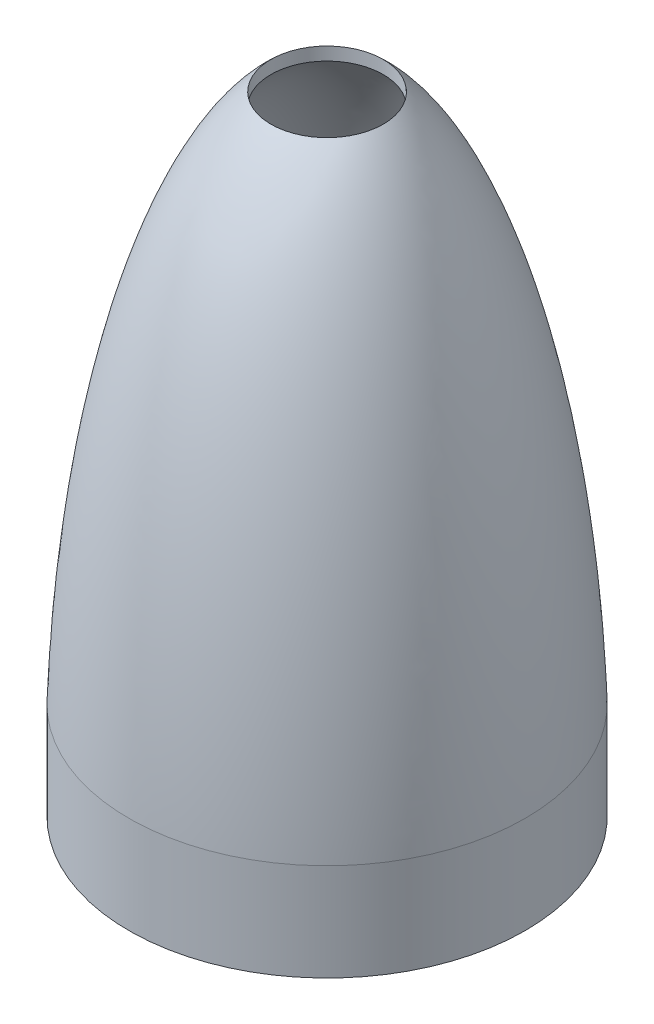
ISO-10303-21;
HEADER;
FILE_DESCRIPTION(('STEP AP214'),'2;1');
FILE_NAME('part.step','',(''),(''),'','','');
FILE_SCHEMA(('AUTOMOTIVE_DESIGN { 1 0 10303 214 1 1 1 1 }'));
ENDSEC;
DATA;
#1=APPLICATION_CONTEXT('core data for automotive mechanical design processes');
#2=APPLICATION_PROTOCOL_DEFINITION('international standard','automotive_design',2000,#1);
#3=PRODUCT_CONTEXT('',#1,'mechanical');
#4=PRODUCT('Part','Part','',(#3));
#5=PRODUCT_RELATED_PRODUCT_CATEGORY('part','',(#4));
#6=PRODUCT_DEFINITION_FORMATION('','',#4);
#7=PRODUCT_DEFINITION_CONTEXT('part definition',#1,'design');
#8=PRODUCT_DEFINITION('design','',#6,#7);
#9=PRODUCT_DEFINITION_SHAPE('','',#8);
#10=(LENGTH_UNIT() NAMED_UNIT(*) SI_UNIT(.MILLI.,.METRE.));
#11=(NAMED_UNIT(*) PLANE_ANGLE_UNIT() SI_UNIT($,.RADIAN.));
#12=(NAMED_UNIT(*) SI_UNIT($,.STERADIAN.) SOLID_ANGLE_UNIT());
#13=UNCERTAINTY_MEASURE_WITH_UNIT(LENGTH_MEASURE(1.E-05),#10,'distance_accuracy_value','');
#14=(GEOMETRIC_REPRESENTATION_CONTEXT(3) GLOBAL_UNCERTAINTY_ASSIGNED_CONTEXT((#13)) GLOBAL_UNIT_ASSIGNED_CONTEXT((#10,
#11,#12)) REPRESENTATION_CONTEXT('',''));
#15=CARTESIAN_POINT('',(0.,0.,0.));
#16=DIRECTION('',(0.,0.,1.));
#17=DIRECTION('',(1.,0.,0.));
#18=AXIS2_PLACEMENT_3D('',#15,#16,#17);
#19=CARTESIAN_POINT('',(0.,0.,0.));
#20=DIRECTION('',(0.,0.,1.));
#21=DIRECTION('',(0.,1.,0.));
#22=AXIS2_PLACEMENT_3D('',#19,#20,#21);
#23=ELLIPSE('',#22,197.916397287442,63.8240305650859);
#24=TRIMMED_CURVE('',#23,(PARAMETER_VALUE(3.14159265358979)),
(PARAMETER_VALUE(6.28318530717959)),.T.,.PARAMETER.);
#25=CARTESIAN_POINT('',(0.,19.918,0.));
#26=DIRECTION('',(0.,-1.,0.));
#27=AXIS1_PLACEMENT('',#25,#26);
#28=SURFACE_OF_REVOLUTION('',#24,#27);
#29=CARTESIAN_POINT('',(0.,189.882362760895,0.));
#30=DIRECTION('',(0.,-1.,0.));
#31=DIRECTION('',(1.,0.,0.));
#32=AXIS2_PLACEMENT_3D('',#29,#30,#31);
#33=CIRCLE('',#32,18.);
#34=CARTESIAN_POINT('',(18.,189.882362760895,0.));
#35=VERTEX_POINT('',#34);
#36=EDGE_CURVE('E65',#35,#35,#33,.T.);
#37=ORIENTED_EDGE('',*,*,#36,.T.);
#38=EDGE_LOOP('',(#37));
#39=FACE_BOUND('',#38,.T.);
#40=CARTESIAN_POINT('',(0.,19.918,0.));
#41=DIRECTION('',(0.,-1.,0.));
#42=DIRECTION('',(1.,0.,0.));
#43=AXIS2_PLACEMENT_3D('',#40,#41,#42);
#44=CIRCLE('',#43,63.5);
#45=CARTESIAN_POINT('',(63.5,19.918,0.));
#46=VERTEX_POINT('',#45);
#47=EDGE_CURVE('E59',#46,#46,#44,.T.);
#48=ORIENTED_EDGE('',*,*,#47,.F.);
#49=EDGE_LOOP('',(#48));
#50=FACE_BOUND('',#49,.T.);
#51=ADVANCED_FACE('F41',(#39,#50),#28,.F.);
#52=CARTESIAN_POINT('',(0.,194.918,0.));
#53=CARTESIAN_POINT('',(0.838027003403198,194.918,0.));
#54=CARTESIAN_POINT('',(2.50348800509016,194.799314319251,0.));
#55=CARTESIAN_POINT('',(5.86823708533804,194.081198554144,0.));
#56=CARTESIAN_POINT('',(10.1460541926094,192.252428145198,0.));
#57=CARTESIAN_POINT('',(15.3902982714895,188.463802804172,0.));
#58=CARTESIAN_POINT('',(22.3996417793312,181.237585071503,0.));
#59=CARTESIAN_POINT('',(30.9343252948244,168.1839351884,0.));
#60=CARTESIAN_POINT('',(40.2045408514973,146.657332097892,0.));
#61=CARTESIAN_POINT('',(48.0987123633596,120.069808877204,0.));
#62=CARTESIAN_POINT('',(53.2754356067489,94.479197256066,0.));
#63=CARTESIAN_POINT('',(56.463723351766,72.4789959620142,0.));
#64=CARTESIAN_POINT('',(58.3579188270842,55.3596395452228,0.));
#65=CARTESIAN_POINT('',(59.5081289443664,40.6955676479391,0.));
#66=CARTESIAN_POINT('',(60.1628103298828,28.8505098918962,0.));
#67=CARTESIAN_POINT('',(60.4027369565591,22.8849660118549,0.));
#68=CARTESIAN_POINT('',(60.5010680847092,19.8854236620052,0.));
#69=CARTESIAN_POINT('',(60.5024013843857,19.8446254236197,0.));
#70=CARTESIAN_POINT('',(60.5031966327738,19.8202458618667,0.));
#71=B_SPLINE_CURVE_WITH_KNOTS('',3,(#52,#53,#54,#55,#56,#57,#58,#59,#60,#61,#62,#63,#64,#65,#66,
#67,#68,#69,#70),.UNSPECIFIED.,.F.,.F.,(4,1,1,1,1,1,1,1,1,1,1,1,1,1,1,1,4),(-1.46998721572434,
-1.42405011523296,-1.37811301474157,-1.2862388137588,-1.19436461277603,-1.10249041179326,
-0.918742009827715,-0.734993607862172,-0.551245205896629,-0.367496803931086,-0.275622602948315,
-0.183748401965543,-0.0918742009827715,-0.0459371004913858,-0.000623650564043343,
-0.000374190338426006,0.),.UNSPECIFIED.);
#72=CARTESIAN_POINT('',(0.,19.918,0.));
#73=DIRECTION('',(0.,-1.,0.));
#74=AXIS1_PLACEMENT('',#72,#73);
#75=SURFACE_OF_REVOLUTION('',#71,#74);
#76=CARTESIAN_POINT('',(0.,185.704217214303,0.));
#77=DIRECTION('',(0.,-1.,0.));
#78=DIRECTION('',(1.,0.,0.));
#79=AXIS2_PLACEMENT_3D('',#76,#77,#78);
#80=CIRCLE('',#79,18.);
#81=CARTESIAN_POINT('',(18.,185.704217214303,0.));
#82=VERTEX_POINT('',#81);
#83=EDGE_CURVE('E107',#82,#82,#80,.F.);
#84=ORIENTED_EDGE('',*,*,#83,.T.);
#85=EDGE_LOOP('',(#84));
#86=FACE_BOUND('',#85,.T.);
#87=CARTESIAN_POINT('',(0.,19.9180000008436,0.));
#88=DIRECTION('',(0.,-1.,0.));
#89=DIRECTION('',(1.,0.,0.));
#90=AXIS2_PLACEMENT_3D('',#87,#88,#89);
#91=CIRCLE('',#90,60.4999999999723);
#92=CARTESIAN_POINT('',(60.4999999999723,19.9180000008436,0.));
#93=VERTEX_POINT('',#92);
#94=EDGE_CURVE('E10',#93,#93,#91,.T.);
#95=ORIENTED_EDGE('',*,*,#94,.T.);
#96=EDGE_LOOP('',(#95));
#97=FACE_BOUND('',#96,.T.);
#98=ADVANCED_FACE('F74',(#86,#97),#75,.F.);
#99=CARTESIAN_POINT('',(0.,19.918,0.));
#100=DIRECTION('',(0.,-1.,0.));
#101=DIRECTION('',(1.,0.,0.));
#102=AXIS2_PLACEMENT_3D('',#99,#100,#101);
#103=CYLINDRICAL_SURFACE('',#102,60.4999999999862);
#104=CARTESIAN_POINT('',(0.,-11.258,0.));
#105=DIRECTION('',(0.,-1.,0.));
#106=DIRECTION('',(1.,0.,0.));
#107=AXIS2_PLACEMENT_3D('',#104,#105,#106);
#108=CIRCLE('',#107,60.5);
#109=CARTESIAN_POINT('',(60.5,-11.258,0.));
#110=VERTEX_POINT('',#109);
#111=EDGE_CURVE('E49',#110,#110,#108,.T.);
#112=ORIENTED_EDGE('',*,*,#111,.T.);
#113=EDGE_LOOP('',(#112));
#114=FACE_BOUND('',#113,.T.);
#115=ORIENTED_EDGE('',*,*,#94,.F.);
#116=EDGE_LOOP('',(#115));
#117=FACE_BOUND('',#116,.T.);
#118=ADVANCED_FACE('F77',(#114,#117),#103,.F.);
#119=CARTESIAN_POINT('',(63.5,-11.258,0.));
#120=DIRECTION('',(0.,-1.,0.));
#121=DIRECTION('',(1.,0.,0.));
#122=AXIS2_PLACEMENT_3D('',#119,#120,#121);
#123=PLANE('',#122);
#124=CARTESIAN_POINT('',(0.,-11.258,0.));
#125=DIRECTION('',(0.,-1.,0.));
#126=DIRECTION('',(1.,0.,0.));
#127=AXIS2_PLACEMENT_3D('',#124,#125,#126);
#128=CIRCLE('',#127,63.5);
#129=CARTESIAN_POINT('',(63.5,-11.258,0.));
#130=VERTEX_POINT('',#129);
#131=EDGE_CURVE('E54',#130,#130,#128,.T.);
#132=ORIENTED_EDGE('',*,*,#131,.T.);
#133=EDGE_LOOP('',(#132));
#134=FACE_BOUND('',#133,.T.);
#135=ORIENTED_EDGE('',*,*,#111,.F.);
#136=EDGE_LOOP('',(#135));
#137=FACE_BOUND('',#136,.T.);
#138=ADVANCED_FACE('F81',(#134,#137),#123,.T.);
#139=CARTESIAN_POINT('',(0.,19.918,0.));
#140=DIRECTION('',(0.,-1.,0.));
#141=DIRECTION('',(1.,0.,0.));
#142=AXIS2_PLACEMENT_3D('',#139,#140,#141);
#143=CYLINDRICAL_SURFACE('',#142,63.5);
#144=ORIENTED_EDGE('',*,*,#47,.T.);
#145=EDGE_LOOP('',(#144));
#146=FACE_BOUND('',#145,.T.);
#147=ORIENTED_EDGE('',*,*,#131,.F.);
#148=EDGE_LOOP('',(#147));
#149=FACE_BOUND('',#148,.T.);
#150=ADVANCED_FACE('F84',(#146,#149),#143,.T.);
#151=CARTESIAN_POINT('',(0.,197.654609084725,0.));
#152=DIRECTION('',(0.,-1.,0.));
#153=DIRECTION('',(1.,0.,0.));
#154=AXIS2_PLACEMENT_3D('',#151,#152,#153);
#155=CYLINDRICAL_SURFACE('',#154,18.);
#156=ORIENTED_EDGE('',*,*,#36,.F.);
#157=EDGE_LOOP('',(#156));
#158=FACE_BOUND('',#157,.T.);
#159=ORIENTED_EDGE('',*,*,#83,.F.);
#160=EDGE_LOOP('',(#159));
#161=FACE_BOUND('',#160,.T.);
#162=ADVANCED_FACE('F88',(#158,#161),#155,.F.);
#163=CLOSED_SHELL('',(#51,#98,#118,#138,#150,#162));
#164=MANIFOLD_SOLID_BREP('B2',#163);
#165=ADVANCED_BREP_SHAPE_REPRESENTATION('',(#18,#164),#14);
#166=SHAPE_DEFINITION_REPRESENTATION(#9,#165);
ENDSEC;
END-ISO-10303-21;
